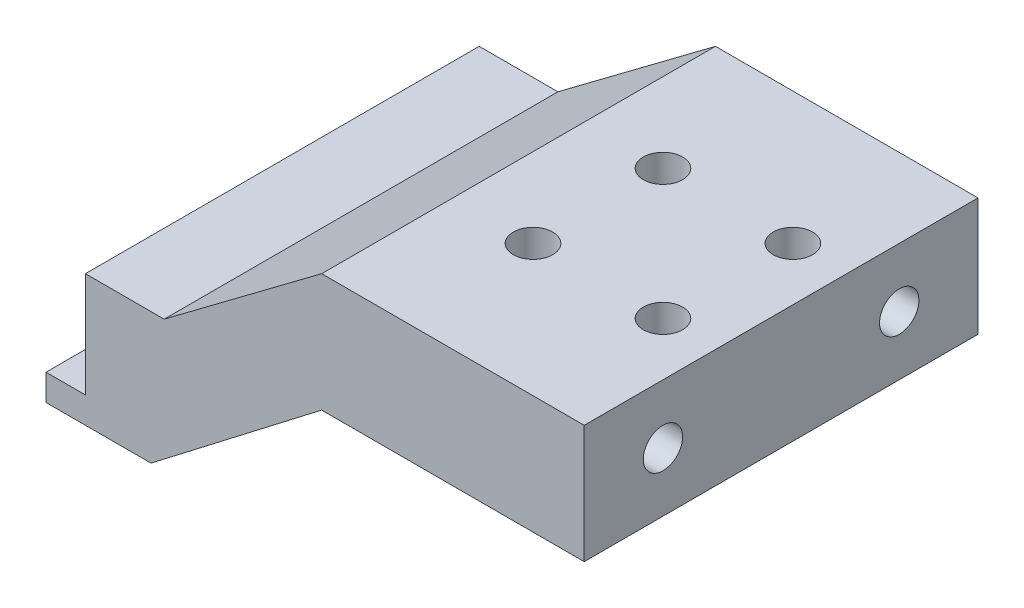
ISO-10303-21;
HEADER;
FILE_DESCRIPTION(('STEP AP214'),'2;1');
FILE_NAME('part.step','',(''),(''),'','','');
FILE_SCHEMA(('AUTOMOTIVE_DESIGN { 1 0 10303 214 1 1 1 1 }'));
ENDSEC;
DATA;
#1=APPLICATION_CONTEXT('core data for automotive mechanical design processes');
#2=APPLICATION_PROTOCOL_DEFINITION('international standard','automotive_design',2000,#1);
#3=PRODUCT_CONTEXT('',#1,'mechanical');
#4=PRODUCT('Part','Part','',(#3));
#5=PRODUCT_RELATED_PRODUCT_CATEGORY('part','',(#4));
#6=PRODUCT_DEFINITION_FORMATION('','',#4);
#7=PRODUCT_DEFINITION_CONTEXT('part definition',#1,'design');
#8=PRODUCT_DEFINITION('design','',#6,#7);
#9=PRODUCT_DEFINITION_SHAPE('','',#8);
#10=(LENGTH_UNIT() NAMED_UNIT(*) SI_UNIT(.MILLI.,.METRE.));
#11=(NAMED_UNIT(*) PLANE_ANGLE_UNIT() SI_UNIT($,.RADIAN.));
#12=(NAMED_UNIT(*) SI_UNIT($,.STERADIAN.) SOLID_ANGLE_UNIT());
#13=UNCERTAINTY_MEASURE_WITH_UNIT(LENGTH_MEASURE(1.E-05),#10,'distance_accuracy_value','');
#14=(GEOMETRIC_REPRESENTATION_CONTEXT(3) GLOBAL_UNCERTAINTY_ASSIGNED_CONTEXT((#13)) GLOBAL_UNIT_ASSIGNED_CONTEXT((#10,
#11,#12)) REPRESENTATION_CONTEXT('',''));
#15=CARTESIAN_POINT('',(0.,0.,0.));
#16=DIRECTION('',(0.,0.,1.));
#17=DIRECTION('',(1.,0.,0.));
#18=AXIS2_PLACEMENT_3D('',#15,#16,#17);
#19=CARTESIAN_POINT('',(41.,10.,0.));
#20=DIRECTION('',(-1.,0.,0.));
#21=DIRECTION('',(0.,0.,1.));
#22=AXIS2_PLACEMENT_3D('',#19,#20,#21);
#23=PLANE('',#22);
#24=CARTESIAN_POINT('',(41.,14.5,-24.));
#25=DIRECTION('',(1.,0.,0.));
#26=DIRECTION('',(0.,0.,-1.));
#27=AXIS2_PLACEMENT_3D('',#24,#25,#26);
#28=CIRCLE('',#27,1.5);
#29=CARTESIAN_POINT('',(41.,14.5,-25.5));
#30=VERTEX_POINT('',#29);
#31=EDGE_CURVE('E207',#30,#30,#28,.T.);
#32=ORIENTED_EDGE('',*,*,#31,.F.);
#33=EDGE_LOOP('',(#32));
#34=FACE_BOUND('',#33,.T.);
#35=CARTESIAN_POINT('',(41.,14.5,-6.));
#36=DIRECTION('',(1.,0.,0.));
#37=DIRECTION('',(0.,0.,-1.));
#38=AXIS2_PLACEMENT_3D('',#35,#36,#37);
#39=CIRCLE('',#38,1.5);
#40=CARTESIAN_POINT('',(41.,14.5,-7.5));
#41=VERTEX_POINT('',#40);
#42=EDGE_CURVE('E230',#41,#41,#39,.T.);
#43=ORIENTED_EDGE('',*,*,#42,.F.);
#44=EDGE_LOOP('',(#43));
#45=FACE_BOUND('',#44,.T.);
#46=DIRECTION('',(0.,0.,1.));
#47=VECTOR('',#46,1.);
#48=CARTESIAN_POINT('',(41.,10.,-30.));
#49=LINE('',#48,#47);
#50=CARTESIAN_POINT('',(41.,10.,-30.));
#51=VERTEX_POINT('',#50);
#52=CARTESIAN_POINT('',(41.,10.,0.));
#53=VERTEX_POINT('',#52);
#54=EDGE_CURVE('E132',#51,#53,#49,.T.);
#55=ORIENTED_EDGE('',*,*,#54,.F.);
#56=DIRECTION('',(0.,-1.,0.));
#57=VECTOR('',#56,1.);
#58=CARTESIAN_POINT('',(41.,10.,-30.));
#59=LINE('',#58,#57);
#60=CARTESIAN_POINT('',(41.,19.,-30.));
#61=VERTEX_POINT('',#60);
#62=EDGE_CURVE('E196',#61,#51,#59,.T.);
#63=ORIENTED_EDGE('',*,*,#62,.F.);
#64=DIRECTION('',(0.,0.,-1.));
#65=VECTOR('',#64,1.);
#66=CARTESIAN_POINT('',(41.,19.,0.));
#67=LINE('',#66,#65);
#68=CARTESIAN_POINT('',(41.,19.,0.));
#69=VERTEX_POINT('',#68);
#70=EDGE_CURVE('E150',#69,#61,#67,.T.);
#71=ORIENTED_EDGE('',*,*,#70,.F.);
#72=DIRECTION('',(0.,-1.,0.));
#73=VECTOR('',#72,1.);
#74=CARTESIAN_POINT('',(41.,10.,0.));
#75=LINE('',#74,#73);
#76=EDGE_CURVE('E44',#69,#53,#75,.T.);
#77=ORIENTED_EDGE('',*,*,#76,.T.);
#78=EDGE_LOOP('',(#55,#63,#71,#77));
#79=FACE_BOUND('',#78,.T.);
#80=ADVANCED_FACE('F35',(#34,#45,#79),#23,.F.);
#81=CARTESIAN_POINT('',(0.,10.,0.));
#82=DIRECTION('',(0.,-1.,0.));
#83=DIRECTION('',(0.,0.,-1.));
#84=AXIS2_PLACEMENT_3D('',#81,#82,#83);
#85=PLANE('',#84);
#86=DIRECTION('',(1.,0.,0.));
#87=VECTOR('',#86,1.);
#88=CARTESIAN_POINT('',(0.,10.,0.));
#89=LINE('',#88,#87);
#90=CARTESIAN_POINT('',(3.,10.,0.));
#91=VERTEX_POINT('',#90);
#92=CARTESIAN_POINT('',(9.,10.,0.));
#93=VERTEX_POINT('',#92);
#94=EDGE_CURVE('E183',#91,#93,#89,.T.);
#95=ORIENTED_EDGE('',*,*,#94,.T.);
#96=DIRECTION('',(0.,0.,-1.));
#97=VECTOR('',#96,1.);
#98=CARTESIAN_POINT('',(9.,10.,0.));
#99=LINE('',#98,#97);
#100=CARTESIAN_POINT('',(9.,10.,-30.));
#101=VERTEX_POINT('',#100);
#102=EDGE_CURVE('E146',#93,#101,#99,.T.);
#103=ORIENTED_EDGE('',*,*,#102,.T.);
#104=DIRECTION('',(-1.,0.,0.));
#105=VECTOR('',#104,1.);
#106=CARTESIAN_POINT('',(0.,10.,-30.));
#107=LINE('',#106,#105);
#108=CARTESIAN_POINT('',(3.,10.,-30.));
#109=VERTEX_POINT('',#108);
#110=EDGE_CURVE('E186',#101,#109,#107,.T.);
#111=ORIENTED_EDGE('',*,*,#110,.T.);
#112=DIRECTION('',(0.,0.,-1.));
#113=VECTOR('',#112,1.);
#114=CARTESIAN_POINT('',(3.,10.,-30.));
#115=LINE('',#114,#113);
#116=EDGE_CURVE('E173',#91,#109,#115,.T.);
#117=ORIENTED_EDGE('',*,*,#116,.F.);
#118=EDGE_LOOP('',(#95,#103,#111,#117));
#119=FACE_BOUND('',#118,.T.);
#120=ADVANCED_FACE('F241',(#119),#85,.F.);
#121=CARTESIAN_POINT('',(0.,0.,0.));
#122=DIRECTION('',(0.,-1.,0.));
#123=DIRECTION('',(0.,0.,-1.));
#124=AXIS2_PLACEMENT_3D('',#121,#122,#123);
#125=PLANE('',#124);
#126=DIRECTION('',(0.,0.,-1.));
#127=VECTOR('',#126,1.);
#128=CARTESIAN_POINT('',(8.,0.,0.));
#129=LINE('',#128,#127);
#130=CARTESIAN_POINT('',(8.,0.,0.));
#131=VERTEX_POINT('',#130);
#132=CARTESIAN_POINT('',(8.,0.,-30.));
#133=VERTEX_POINT('',#132);
#134=EDGE_CURVE('E128',#131,#133,#129,.T.);
#135=ORIENTED_EDGE('',*,*,#134,.F.);
#136=DIRECTION('',(1.,0.,0.));
#137=VECTOR('',#136,1.);
#138=CARTESIAN_POINT('',(0.,0.,0.));
#139=LINE('',#138,#137);
#140=CARTESIAN_POINT('',(0.,0.,0.));
#141=VERTEX_POINT('',#140);
#142=EDGE_CURVE('E127',#141,#131,#139,.T.);
#143=ORIENTED_EDGE('',*,*,#142,.F.);
#144=DIRECTION('',(0.,0.,1.));
#145=VECTOR('',#144,1.);
#146=CARTESIAN_POINT('',(0.,0.,0.));
#147=LINE('',#146,#145);
#148=CARTESIAN_POINT('',(0.,0.,-30.));
#149=VERTEX_POINT('',#148);
#150=EDGE_CURVE('E181',#149,#141,#147,.T.);
#151=ORIENTED_EDGE('',*,*,#150,.F.);
#152=DIRECTION('',(-1.,0.,0.));
#153=VECTOR('',#152,1.);
#154=CARTESIAN_POINT('',(0.,0.,-30.));
#155=LINE('',#154,#153);
#156=EDGE_CURVE('E187',#133,#149,#155,.T.);
#157=ORIENTED_EDGE('',*,*,#156,.F.);
#158=EDGE_LOOP('',(#135,#143,#151,#157));
#159=FACE_BOUND('',#158,.T.);
#160=ADVANCED_FACE('F270',(#159),#125,.T.);
#161=CARTESIAN_POINT('',(0.,10.,0.));
#162=DIRECTION('',(1.,0.,0.));
#163=DIRECTION('',(0.,0.,-1.));
#164=AXIS2_PLACEMENT_3D('',#161,#162,#163);
#165=PLANE('',#164);
#166=DIRECTION('',(0.,-1.,0.));
#167=VECTOR('',#166,1.);
#168=CARTESIAN_POINT('',(0.,10.,0.));
#169=LINE('',#168,#167);
#170=CARTESIAN_POINT('',(0.,2.,0.));
#171=VERTEX_POINT('',#170);
#172=EDGE_CURVE('E11',#171,#141,#169,.T.);
#173=ORIENTED_EDGE('',*,*,#172,.F.);
#174=DIRECTION('',(0.,0.,1.));
#175=VECTOR('',#174,1.);
#176=CARTESIAN_POINT('',(0.,2.,-30.));
#177=LINE('',#176,#175);
#178=CARTESIAN_POINT('',(0.,2.,-30.));
#179=VERTEX_POINT('',#178);
#180=EDGE_CURVE('E168',#179,#171,#177,.T.);
#181=ORIENTED_EDGE('',*,*,#180,.F.);
#182=DIRECTION('',(0.,-1.,0.));
#183=VECTOR('',#182,1.);
#184=CARTESIAN_POINT('',(0.,10.,-30.));
#185=LINE('',#184,#183);
#186=EDGE_CURVE('E189',#179,#149,#185,.T.);
#187=ORIENTED_EDGE('',*,*,#186,.T.);
#188=ORIENTED_EDGE('',*,*,#150,.T.);
#189=EDGE_LOOP('',(#173,#181,#187,#188));
#190=FACE_BOUND('',#189,.T.);
#191=ADVANCED_FACE('F37',(#190),#165,.F.);
#192=CARTESIAN_POINT('',(0.,10.,0.));
#193=DIRECTION('',(0.,0.,-1.));
#194=DIRECTION('',(-1.,0.,0.));
#195=AXIS2_PLACEMENT_3D('',#192,#193,#194);
#196=PLANE('',#195);
#197=ORIENTED_EDGE('',*,*,#142,.T.);
#198=DIRECTION('',(0.7926239891046,0.609710760849692,0.));
#199=VECTOR('',#198,1.);
#200=CARTESIAN_POINT('',(8.,0.,0.));
#201=LINE('',#200,#199);
#202=CARTESIAN_POINT('',(21.,10.,0.));
#203=VERTEX_POINT('',#202);
#204=EDGE_CURVE('E113',#131,#203,#201,.T.);
#205=ORIENTED_EDGE('',*,*,#204,.T.);
#206=DIRECTION('',(-1.,0.,0.));
#207=VECTOR('',#206,1.);
#208=CARTESIAN_POINT('',(41.,10.,0.));
#209=LINE('',#208,#207);
#210=EDGE_CURVE('E119',#53,#203,#209,.T.);
#211=ORIENTED_EDGE('',*,*,#210,.F.);
#212=ORIENTED_EDGE('',*,*,#76,.F.);
#213=DIRECTION('',(1.,0.,0.));
#214=VECTOR('',#213,1.);
#215=CARTESIAN_POINT('',(41.,19.,0.));
#216=LINE('',#215,#214);
#217=CARTESIAN_POINT('',(21.,19.,0.));
#218=VERTEX_POINT('',#217);
#219=EDGE_CURVE('E142',#218,#69,#216,.T.);
#220=ORIENTED_EDGE('',*,*,#219,.F.);
#221=DIRECTION('',(0.8,0.6,0.));
#222=VECTOR('',#221,1.);
#223=CARTESIAN_POINT('',(21.,19.,0.));
#224=LINE('',#223,#222);
#225=EDGE_CURVE('E139',#93,#218,#224,.T.);
#226=ORIENTED_EDGE('',*,*,#225,.F.);
#227=ORIENTED_EDGE('',*,*,#94,.F.);
#228=DIRECTION('',(0.,1.,0.));
#229=VECTOR('',#228,1.);
#230=CARTESIAN_POINT('',(3.,10.,0.));
#231=LINE('',#230,#229);
#232=CARTESIAN_POINT('',(3.,2.,0.));
#233=VERTEX_POINT('',#232);
#234=EDGE_CURVE('E171',#233,#91,#231,.T.);
#235=ORIENTED_EDGE('',*,*,#234,.F.);
#236=DIRECTION('',(-1.,0.,0.));
#237=VECTOR('',#236,1.);
#238=CARTESIAN_POINT('',(3.,2.,0.));
#239=LINE('',#238,#237);
#240=EDGE_CURVE('E178',#233,#171,#239,.T.);
#241=ORIENTED_EDGE('',*,*,#240,.T.);
#242=ORIENTED_EDGE('',*,*,#172,.T.);
#243=EDGE_LOOP('',(#197,#205,#211,#212,#220,#226,#227,#235,#241,#242));
#244=FACE_BOUND('',#243,.T.);
#245=ADVANCED_FACE('F124',(#244),#196,.F.);
#246=CARTESIAN_POINT('',(0.,10.,-30.));
#247=DIRECTION('',(0.,0.,1.));
#248=DIRECTION('',(1.,0.,0.));
#249=AXIS2_PLACEMENT_3D('',#246,#247,#248);
#250=PLANE('',#249);
#251=DIRECTION('',(1.,0.,0.));
#252=VECTOR('',#251,1.);
#253=CARTESIAN_POINT('',(41.,10.,-30.));
#254=LINE('',#253,#252);
#255=CARTESIAN_POINT('',(21.,10.,-30.));
#256=VERTEX_POINT('',#255);
#257=EDGE_CURVE('E118',#256,#51,#254,.T.);
#258=ORIENTED_EDGE('',*,*,#257,.F.);
#259=DIRECTION('',(0.7926239891046,0.609710760849692,0.));
#260=VECTOR('',#259,1.);
#261=CARTESIAN_POINT('',(8.,0.,-30.));
#262=LINE('',#261,#260);
#263=EDGE_CURVE('E52',#133,#256,#262,.T.);
#264=ORIENTED_EDGE('',*,*,#263,.F.);
#265=ORIENTED_EDGE('',*,*,#156,.T.);
#266=ORIENTED_EDGE('',*,*,#186,.F.);
#267=DIRECTION('',(-1.,0.,0.));
#268=VECTOR('',#267,1.);
#269=CARTESIAN_POINT('',(3.,2.,-30.));
#270=LINE('',#269,#268);
#271=CARTESIAN_POINT('',(3.,2.,-30.));
#272=VERTEX_POINT('',#271);
#273=EDGE_CURVE('E176',#272,#179,#270,.T.);
#274=ORIENTED_EDGE('',*,*,#273,.F.);
#275=DIRECTION('',(0.,-1.,0.));
#276=VECTOR('',#275,1.);
#277=CARTESIAN_POINT('',(3.,10.,-30.));
#278=LINE('',#277,#276);
#279=EDGE_CURVE('E164',#109,#272,#278,.T.);
#280=ORIENTED_EDGE('',*,*,#279,.F.);
#281=ORIENTED_EDGE('',*,*,#110,.F.);
#282=DIRECTION('',(0.8,0.6,0.));
#283=VECTOR('',#282,1.);
#284=CARTESIAN_POINT('',(21.,19.,-30.));
#285=LINE('',#284,#283);
#286=CARTESIAN_POINT('',(21.,19.,-30.));
#287=VERTEX_POINT('',#286);
#288=EDGE_CURVE('E60',#101,#287,#285,.T.);
#289=ORIENTED_EDGE('',*,*,#288,.T.);
#290=DIRECTION('',(1.,0.,0.));
#291=VECTOR('',#290,1.);
#292=CARTESIAN_POINT('',(41.,19.,-30.));
#293=LINE('',#292,#291);
#294=EDGE_CURVE('E143',#287,#61,#293,.T.);
#295=ORIENTED_EDGE('',*,*,#294,.T.);
#296=ORIENTED_EDGE('',*,*,#62,.T.);
#297=EDGE_LOOP('',(#258,#264,#265,#266,#274,#280,#281,#289,#295,#296));
#298=FACE_BOUND('',#297,.T.);
#299=ADVANCED_FACE('F246',(#298),#250,.F.);
#300=CARTESIAN_POINT('',(3.,2.,-30.));
#301=DIRECTION('',(0.,-1.,0.));
#302=DIRECTION('',(0.,0.,-1.));
#303=AXIS2_PLACEMENT_3D('',#300,#301,#302);
#304=PLANE('',#303);
#305=ORIENTED_EDGE('',*,*,#180,.T.);
#306=ORIENTED_EDGE('',*,*,#240,.F.);
#307=DIRECTION('',(0.,0.,1.));
#308=VECTOR('',#307,1.);
#309=CARTESIAN_POINT('',(3.,2.,-30.));
#310=LINE('',#309,#308);
#311=EDGE_CURVE('E167',#272,#233,#310,.T.);
#312=ORIENTED_EDGE('',*,*,#311,.F.);
#313=ORIENTED_EDGE('',*,*,#273,.T.);
#314=EDGE_LOOP('',(#305,#306,#312,#313));
#315=FACE_BOUND('',#314,.T.);
#316=ADVANCED_FACE('F342',(#315),#304,.F.);
#317=CARTESIAN_POINT('',(3.,0.,0.));
#318=DIRECTION('',(-1.,0.,0.));
#319=DIRECTION('',(0.,0.,1.));
#320=AXIS2_PLACEMENT_3D('',#317,#318,#319);
#321=PLANE('',#320);
#322=CARTESIAN_POINT('',(3.,5.4,-10.));
#323=DIRECTION('',(-1.,0.,0.));
#324=DIRECTION('',(0.,0.,1.));
#325=AXIS2_PLACEMENT_3D('',#322,#323,#324);
#326=CIRCLE('',#325,1.);
#327=CARTESIAN_POINT('',(3.,5.4,-9.));
#328=VERTEX_POINT('',#327);
#329=EDGE_CURVE('E159',#328,#328,#326,.T.);
#330=ORIENTED_EDGE('',*,*,#329,.F.);
#331=EDGE_LOOP('',(#330));
#332=FACE_BOUND('',#331,.T.);
#333=CARTESIAN_POINT('',(3.,5.4,-20.));
#334=DIRECTION('',(-1.,0.,0.));
#335=DIRECTION('',(0.,0.,1.));
#336=AXIS2_PLACEMENT_3D('',#333,#334,#335);
#337=CIRCLE('',#336,1.);
#338=CARTESIAN_POINT('',(3.,5.4,-19.));
#339=VERTEX_POINT('',#338);
#340=EDGE_CURVE('E163',#339,#339,#337,.T.);
#341=ORIENTED_EDGE('',*,*,#340,.F.);
#342=EDGE_LOOP('',(#341));
#343=FACE_BOUND('',#342,.T.);
#344=ORIENTED_EDGE('',*,*,#279,.T.);
#345=ORIENTED_EDGE('',*,*,#311,.T.);
#346=ORIENTED_EDGE('',*,*,#234,.T.);
#347=ORIENTED_EDGE('',*,*,#116,.T.);
#348=EDGE_LOOP('',(#344,#345,#346,#347));
#349=FACE_BOUND('',#348,.T.);
#350=ADVANCED_FACE('F261',(#332,#343,#349),#321,.T.);
#351=CARTESIAN_POINT('',(7.,5.4,-20.));
#352=DIRECTION('',(-1.,0.,0.));
#353=DIRECTION('',(0.,0.,1.));
#354=AXIS2_PLACEMENT_3D('',#351,#352,#353);
#355=CYLINDRICAL_SURFACE('',#354,1.);
#356=ORIENTED_EDGE('',*,*,#340,.T.);
#357=EDGE_LOOP('',(#356));
#358=FACE_BOUND('',#357,.T.);
#359=CARTESIAN_POINT('',(7.,5.4,-20.));
#360=DIRECTION('',(-1.,0.,0.));
#361=DIRECTION('',(0.,0.,1.));
#362=AXIS2_PLACEMENT_3D('',#359,#360,#361);
#363=CIRCLE('',#362,1.);
#364=CARTESIAN_POINT('',(7.,5.4,-19.));
#365=VERTEX_POINT('',#364);
#366=EDGE_CURVE('E160',#365,#365,#363,.T.);
#367=ORIENTED_EDGE('',*,*,#366,.F.);
#368=EDGE_LOOP('',(#367));
#369=FACE_BOUND('',#368,.T.);
#370=ADVANCED_FACE('F335',(#358,#369),#355,.F.);
#371=CARTESIAN_POINT('',(7.,5.4,-20.));
#372=DIRECTION('',(-1.,0.,0.));
#373=DIRECTION('',(0.,0.,1.));
#374=AXIS2_PLACEMENT_3D('',#371,#372,#373);
#375=PLANE('',#374);
#376=ORIENTED_EDGE('',*,*,#366,.T.);
#377=EDGE_LOOP('',(#376));
#378=FACE_BOUND('',#377,.T.);
#379=ADVANCED_FACE('F331',(#378),#375,.T.);
#380=CARTESIAN_POINT('',(7.,5.4,-10.));
#381=DIRECTION('',(-1.,0.,0.));
#382=DIRECTION('',(0.,0.,1.));
#383=AXIS2_PLACEMENT_3D('',#380,#381,#382);
#384=CYLINDRICAL_SURFACE('',#383,1.);
#385=ORIENTED_EDGE('',*,*,#329,.T.);
#386=EDGE_LOOP('',(#385));
#387=FACE_BOUND('',#386,.T.);
#388=CARTESIAN_POINT('',(7.,5.4,-10.));
#389=DIRECTION('',(-1.,0.,0.));
#390=DIRECTION('',(0.,0.,1.));
#391=AXIS2_PLACEMENT_3D('',#388,#389,#390);
#392=CIRCLE('',#391,1.);
#393=CARTESIAN_POINT('',(7.,5.4,-9.));
#394=VERTEX_POINT('',#393);
#395=EDGE_CURVE('E153',#394,#394,#392,.T.);
#396=ORIENTED_EDGE('',*,*,#395,.F.);
#397=EDGE_LOOP('',(#396));
#398=FACE_BOUND('',#397,.T.);
#399=ADVANCED_FACE('F327',(#387,#398),#384,.F.);
#400=CARTESIAN_POINT('',(7.,5.4,-10.));
#401=DIRECTION('',(-1.,0.,0.));
#402=DIRECTION('',(0.,0.,1.));
#403=AXIS2_PLACEMENT_3D('',#400,#401,#402);
#404=PLANE('',#403);
#405=ORIENTED_EDGE('',*,*,#395,.T.);
#406=EDGE_LOOP('',(#405));
#407=FACE_BOUND('',#406,.T.);
#408=ADVANCED_FACE('F321',(#407),#404,.T.);
#409=CARTESIAN_POINT('',(21.,19.,0.));
#410=DIRECTION('',(-0.6,0.8,0.));
#411=DIRECTION('',(-0.8,-0.6,0.));
#412=AXIS2_PLACEMENT_3D('',#409,#410,#411);
#413=PLANE('',#412);
#414=ORIENTED_EDGE('',*,*,#288,.F.);
#415=ORIENTED_EDGE('',*,*,#102,.F.);
#416=ORIENTED_EDGE('',*,*,#225,.T.);
#417=DIRECTION('',(0.,0.,-1.));
#418=VECTOR('',#417,1.);
#419=CARTESIAN_POINT('',(21.,19.,0.));
#420=LINE('',#419,#418);
#421=EDGE_CURVE('E154',#218,#287,#420,.T.);
#422=ORIENTED_EDGE('',*,*,#421,.T.);
#423=EDGE_LOOP('',(#414,#415,#416,#422));
#424=FACE_BOUND('',#423,.T.);
#425=ADVANCED_FACE('F254',(#424),#413,.T.);
#426=CARTESIAN_POINT('',(41.,19.,0.));
#427=DIRECTION('',(0.,1.,0.));
#428=DIRECTION('',(0.,0.,1.));
#429=AXIS2_PLACEMENT_3D('',#426,#427,#428);
#430=PLANE('',#429);
#431=CARTESIAN_POINT('',(36.949747468306,19.,-10.0502525316942));
#432=DIRECTION('',(0.,1.,0.));
#433=DIRECTION('',(0.,0.,1.));
#434=AXIS2_PLACEMENT_3D('',#431,#432,#433);
#435=CIRCLE('',#434,1.49999999999999);
#436=CARTESIAN_POINT('',(36.949747468306,19.,-8.55025253169417));
#437=VERTEX_POINT('',#436);
#438=EDGE_CURVE('E212',#437,#437,#435,.T.);
#439=ORIENTED_EDGE('',*,*,#438,.F.);
#440=EDGE_LOOP('',(#439));
#441=FACE_BOUND('',#440,.T.);
#442=CARTESIAN_POINT('',(27.0502525316943,19.,-10.0502525316941));
#443=DIRECTION('',(0.,1.,0.));
#444=DIRECTION('',(0.,0.,1.));
#445=AXIS2_PLACEMENT_3D('',#442,#443,#444);
#446=CIRCLE('',#445,1.5);
#447=CARTESIAN_POINT('',(27.0502525316943,19.,-8.55025253169405));
#448=VERTEX_POINT('',#447);
#449=EDGE_CURVE('E273',#448,#448,#446,.T.);
#450=ORIENTED_EDGE('',*,*,#449,.F.);
#451=EDGE_LOOP('',(#450));
#452=FACE_BOUND('',#451,.T.);
#453=CARTESIAN_POINT('',(27.0502525316942,19.,-19.9497474683057));
#454=DIRECTION('',(0.,1.,0.));
#455=DIRECTION('',(0.,0.,1.));
#456=AXIS2_PLACEMENT_3D('',#453,#454,#455);
#457=CIRCLE('',#456,1.5);
#458=CARTESIAN_POINT('',(27.0502525316942,19.,-18.4497474683057));
#459=VERTEX_POINT('',#458);
#460=EDGE_CURVE('E225',#459,#459,#457,.T.);
#461=ORIENTED_EDGE('',*,*,#460,.F.);
#462=EDGE_LOOP('',(#461));
#463=FACE_BOUND('',#462,.T.);
#464=CARTESIAN_POINT('',(36.9497474683058,19.,-19.9497474683058));
#465=DIRECTION('',(0.,1.,0.));
#466=DIRECTION('',(0.,0.,1.));
#467=AXIS2_PLACEMENT_3D('',#464,#465,#466);
#468=CIRCLE('',#467,1.49999999999999);
#469=CARTESIAN_POINT('',(36.9497474683058,19.,-18.4497474683058));
#470=VERTEX_POINT('',#469);
#471=EDGE_CURVE('E208',#470,#470,#468,.T.);
#472=ORIENTED_EDGE('',*,*,#471,.F.);
#473=EDGE_LOOP('',(#472));
#474=FACE_BOUND('',#473,.T.);
#475=ORIENTED_EDGE('',*,*,#294,.F.);
#476=ORIENTED_EDGE('',*,*,#421,.F.);
#477=ORIENTED_EDGE('',*,*,#219,.T.);
#478=ORIENTED_EDGE('',*,*,#70,.T.);
#479=EDGE_LOOP('',(#475,#476,#477,#478));
#480=FACE_BOUND('',#479,.T.);
#481=ADVANCED_FACE('F250',(#441,#452,#463,#474,#480),#430,.T.);
#482=CARTESIAN_POINT('',(41.,10.,0.));
#483=DIRECTION('',(0.,-1.,0.));
#484=DIRECTION('',(0.,0.,-1.));
#485=AXIS2_PLACEMENT_3D('',#482,#483,#484);
#486=PLANE('',#485);
#487=CARTESIAN_POINT('',(36.949747468306,10.,-10.0502525316942));
#488=DIRECTION('',(0.,-1.,0.));
#489=DIRECTION('',(0.,0.,-1.));
#490=AXIS2_PLACEMENT_3D('',#487,#488,#489);
#491=CIRCLE('',#490,1.49999999999999);
#492=CARTESIAN_POINT('',(36.949747468306,10.,-11.5502525316942));
#493=VERTEX_POINT('',#492);
#494=EDGE_CURVE('E39',#493,#493,#491,.T.);
#495=ORIENTED_EDGE('',*,*,#494,.F.);
#496=EDGE_LOOP('',(#495));
#497=FACE_BOUND('',#496,.T.);
#498=CARTESIAN_POINT('',(27.0502525316943,10.,-10.0502525316941));
#499=DIRECTION('',(0.,-1.,0.));
#500=DIRECTION('',(0.,0.,-1.));
#501=AXIS2_PLACEMENT_3D('',#498,#499,#500);
#502=CIRCLE('',#501,1.5);
#503=CARTESIAN_POINT('',(27.0502525316943,10.,-11.5502525316941));
#504=VERTEX_POINT('',#503);
#505=EDGE_CURVE('E211',#504,#504,#502,.T.);
#506=ORIENTED_EDGE('',*,*,#505,.F.);
#507=EDGE_LOOP('',(#506));
#508=FACE_BOUND('',#507,.T.);
#509=CARTESIAN_POINT('',(27.0502525316942,10.,-19.9497474683057));
#510=DIRECTION('',(0.,-1.,0.));
#511=DIRECTION('',(0.,0.,-1.));
#512=AXIS2_PLACEMENT_3D('',#509,#510,#511);
#513=CIRCLE('',#512,1.5);
#514=CARTESIAN_POINT('',(27.0502525316942,10.,-21.4497474683057));
#515=VERTEX_POINT('',#514);
#516=EDGE_CURVE('E209',#515,#515,#513,.T.);
#517=ORIENTED_EDGE('',*,*,#516,.F.);
#518=EDGE_LOOP('',(#517));
#519=FACE_BOUND('',#518,.T.);
#520=CARTESIAN_POINT('',(36.9497474683058,10.,-19.9497474683058));
#521=DIRECTION('',(0.,-1.,0.));
#522=DIRECTION('',(0.,0.,-1.));
#523=AXIS2_PLACEMENT_3D('',#520,#521,#522);
#524=CIRCLE('',#523,1.49999999999999);
#525=CARTESIAN_POINT('',(36.9497474683058,10.,-21.4497474683058));
#526=VERTEX_POINT('',#525);
#527=EDGE_CURVE('E204',#526,#526,#524,.T.);
#528=ORIENTED_EDGE('',*,*,#527,.F.);
#529=EDGE_LOOP('',(#528));
#530=FACE_BOUND('',#529,.T.);
#531=ORIENTED_EDGE('',*,*,#54,.T.);
#532=ORIENTED_EDGE('',*,*,#210,.T.);
#533=DIRECTION('',(0.,0.,-1.));
#534=VECTOR('',#533,1.);
#535=CARTESIAN_POINT('',(21.,10.,-30.));
#536=LINE('',#535,#534);
#537=EDGE_CURVE('E110',#203,#256,#536,.T.);
#538=ORIENTED_EDGE('',*,*,#537,.T.);
#539=ORIENTED_EDGE('',*,*,#257,.T.);
#540=EDGE_LOOP('',(#531,#532,#538,#539));
#541=FACE_BOUND('',#540,.T.);
#542=ADVANCED_FACE('F130',(#497,#508,#519,#530,#541),#486,.T.);
#543=CARTESIAN_POINT('',(35.,14.5,-6.));
#544=DIRECTION('',(1.,0.,0.));
#545=DIRECTION('',(0.,0.,-1.));
#546=AXIS2_PLACEMENT_3D('',#543,#544,#545);
#547=CYLINDRICAL_SURFACE('',#546,1.5);
#548=CARTESIAN_POINT('',(35.,14.5,-6.));
#549=DIRECTION('',(1.,0.,0.));
#550=DIRECTION('',(0.,0.,-1.));
#551=AXIS2_PLACEMENT_3D('',#548,#549,#550);
#552=CIRCLE('',#551,1.5);
#553=CARTESIAN_POINT('',(35.,14.5,-7.5));
#554=VERTEX_POINT('',#553);
#555=EDGE_CURVE('E134',#554,#554,#552,.T.);
#556=ORIENTED_EDGE('',*,*,#555,.F.);
#557=EDGE_LOOP('',(#556));
#558=FACE_BOUND('',#557,.T.);
#559=ORIENTED_EDGE('',*,*,#42,.T.);
#560=EDGE_LOOP('',(#559));
#561=FACE_BOUND('',#560,.T.);
#562=ADVANCED_FACE('F237',(#558,#561),#547,.F.);
#563=CARTESIAN_POINT('',(35.,14.5,-6.));
#564=DIRECTION('',(1.,0.,0.));
#565=DIRECTION('',(0.,0.,-1.));
#566=AXIS2_PLACEMENT_3D('',#563,#564,#565);
#567=PLANE('',#566);
#568=ORIENTED_EDGE('',*,*,#555,.T.);
#569=EDGE_LOOP('',(#568));
#570=FACE_BOUND('',#569,.T.);
#571=ADVANCED_FACE('F311',(#570),#567,.T.);
#572=CARTESIAN_POINT('',(35.,14.5,-24.));
#573=DIRECTION('',(1.,0.,0.));
#574=DIRECTION('',(0.,0.,-1.));
#575=AXIS2_PLACEMENT_3D('',#572,#573,#574);
#576=CYLINDRICAL_SURFACE('',#575,1.5);
#577=CARTESIAN_POINT('',(35.,14.5,-24.));
#578=DIRECTION('',(1.,0.,0.));
#579=DIRECTION('',(0.,0.,-1.));
#580=AXIS2_PLACEMENT_3D('',#577,#578,#579);
#581=CIRCLE('',#580,1.5);
#582=CARTESIAN_POINT('',(35.,14.5,-25.5));
#583=VERTEX_POINT('',#582);
#584=EDGE_CURVE('E227',#583,#583,#581,.T.);
#585=ORIENTED_EDGE('',*,*,#584,.F.);
#586=EDGE_LOOP('',(#585));
#587=FACE_BOUND('',#586,.T.);
#588=ORIENTED_EDGE('',*,*,#31,.T.);
#589=EDGE_LOOP('',(#588));
#590=FACE_BOUND('',#589,.T.);
#591=ADVANCED_FACE('F307',(#587,#590),#576,.F.);
#592=CARTESIAN_POINT('',(35.,14.5,-24.));
#593=DIRECTION('',(1.,0.,0.));
#594=DIRECTION('',(0.,0.,-1.));
#595=AXIS2_PLACEMENT_3D('',#592,#593,#594);
#596=PLANE('',#595);
#597=ORIENTED_EDGE('',*,*,#584,.T.);
#598=EDGE_LOOP('',(#597));
#599=FACE_BOUND('',#598,.T.);
#600=ADVANCED_FACE('F300',(#599),#596,.T.);
#601=CARTESIAN_POINT('',(36.9497474683058,0.,-19.9497474683058));
#602=DIRECTION('',(0.,1.,0.));
#603=DIRECTION('',(0.,0.,1.));
#604=AXIS2_PLACEMENT_3D('',#601,#602,#603);
#605=CYLINDRICAL_SURFACE('',#604,1.49999999999999);
#606=ORIENTED_EDGE('',*,*,#527,.T.);
#607=EDGE_LOOP('',(#606));
#608=FACE_BOUND('',#607,.T.);
#609=ORIENTED_EDGE('',*,*,#471,.T.);
#610=EDGE_LOOP('',(#609));
#611=FACE_BOUND('',#610,.T.);
#612=ADVANCED_FACE('F291',(#608,#611),#605,.F.);
#613=CARTESIAN_POINT('',(27.0502525316942,0.,-19.9497474683057));
#614=DIRECTION('',(0.,1.,0.));
#615=DIRECTION('',(0.,0.,1.));
#616=AXIS2_PLACEMENT_3D('',#613,#614,#615);
#617=CYLINDRICAL_SURFACE('',#616,1.5);
#618=ORIENTED_EDGE('',*,*,#516,.T.);
#619=EDGE_LOOP('',(#618));
#620=FACE_BOUND('',#619,.T.);
#621=ORIENTED_EDGE('',*,*,#460,.T.);
#622=EDGE_LOOP('',(#621));
#623=FACE_BOUND('',#622,.T.);
#624=ADVANCED_FACE('F289',(#620,#623),#617,.F.);
#625=CARTESIAN_POINT('',(27.0502525316943,0.,-10.0502525316941));
#626=DIRECTION('',(0.,1.,0.));
#627=DIRECTION('',(0.,0.,1.));
#628=AXIS2_PLACEMENT_3D('',#625,#626,#627);
#629=CYLINDRICAL_SURFACE('',#628,1.5);
#630=ORIENTED_EDGE('',*,*,#505,.T.);
#631=EDGE_LOOP('',(#630));
#632=FACE_BOUND('',#631,.T.);
#633=ORIENTED_EDGE('',*,*,#449,.T.);
#634=EDGE_LOOP('',(#633));
#635=FACE_BOUND('',#634,.T.);
#636=ADVANCED_FACE('F280',(#632,#635),#629,.F.);
#637=CARTESIAN_POINT('',(36.949747468306,0.,-10.0502525316942));
#638=DIRECTION('',(0.,1.,0.));
#639=DIRECTION('',(0.,0.,1.));
#640=AXIS2_PLACEMENT_3D('',#637,#638,#639);
#641=CYLINDRICAL_SURFACE('',#640,1.49999999999999);
#642=ORIENTED_EDGE('',*,*,#494,.T.);
#643=EDGE_LOOP('',(#642));
#644=FACE_BOUND('',#643,.T.);
#645=ORIENTED_EDGE('',*,*,#438,.T.);
#646=EDGE_LOOP('',(#645));
#647=FACE_BOUND('',#646,.T.);
#648=ADVANCED_FACE('F298',(#644,#647),#641,.F.);
#649=CARTESIAN_POINT('',(8.,0.,0.));
#650=DIRECTION('',(-0.609710760849692,0.7926239891046,0.));
#651=DIRECTION('',(-0.7926239891046,-0.609710760849692,0.));
#652=AXIS2_PLACEMENT_3D('',#649,#650,#651);
#653=PLANE('',#652);
#654=ORIENTED_EDGE('',*,*,#263,.T.);
#655=ORIENTED_EDGE('',*,*,#537,.F.);
#656=ORIENTED_EDGE('',*,*,#204,.F.);
#657=ORIENTED_EDGE('',*,*,#134,.T.);
#658=EDGE_LOOP('',(#654,#655,#656,#657));
#659=FACE_BOUND('',#658,.T.);
#660=ADVANCED_FACE('F112',(#659),#653,.F.);
#661=CLOSED_SHELL('',(#80,#120,#160,#191,#245,#299,#316,#350,#370,#379,#399,#408,#425,#481,#542,
#562,#571,#591,#600,#612,#624,#636,#648,#660));
#662=MANIFOLD_SOLID_BREP('B2',#661);
#663=ADVANCED_BREP_SHAPE_REPRESENTATION('',(#18,#662),#14);
#664=SHAPE_DEFINITION_REPRESENTATION(#9,#663);
ENDSEC;
END-ISO-10303-21;
